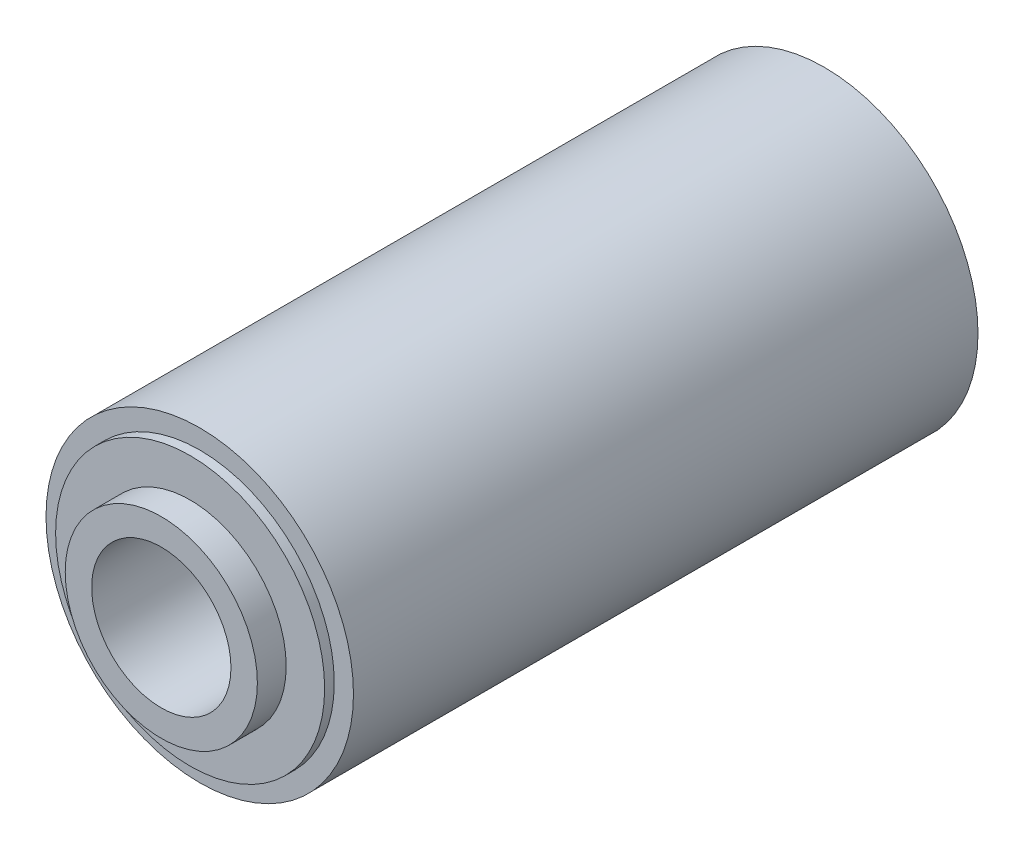
ISO-10303-21;
HEADER;
FILE_DESCRIPTION(('STEP AP214'),'2;1');
FILE_NAME('part.step','',(''),(''),'','','');
FILE_SCHEMA(('AUTOMOTIVE_DESIGN { 1 0 10303 214 1 1 1 1 }'));
ENDSEC;
DATA;
#1=APPLICATION_CONTEXT('core data for automotive mechanical design processes');
#2=APPLICATION_PROTOCOL_DEFINITION('international standard','automotive_design',2000,#1);
#3=PRODUCT_CONTEXT('',#1,'mechanical');
#4=PRODUCT('Part','Part','',(#3));
#5=PRODUCT_RELATED_PRODUCT_CATEGORY('part','',(#4));
#6=PRODUCT_DEFINITION_FORMATION('','',#4);
#7=PRODUCT_DEFINITION_CONTEXT('part definition',#1,'design');
#8=PRODUCT_DEFINITION('design','',#6,#7);
#9=PRODUCT_DEFINITION_SHAPE('','',#8);
#10=(LENGTH_UNIT() NAMED_UNIT(*) SI_UNIT(.MILLI.,.METRE.));
#11=(NAMED_UNIT(*) PLANE_ANGLE_UNIT() SI_UNIT($,.RADIAN.));
#12=(NAMED_UNIT(*) SI_UNIT($,.STERADIAN.) SOLID_ANGLE_UNIT());
#13=UNCERTAINTY_MEASURE_WITH_UNIT(LENGTH_MEASURE(1.E-05),#10,'distance_accuracy_value','');
#14=(GEOMETRIC_REPRESENTATION_CONTEXT(3) GLOBAL_UNCERTAINTY_ASSIGNED_CONTEXT((#13)) GLOBAL_UNIT_ASSIGNED_CONTEXT((#10,
#11,#12)) REPRESENTATION_CONTEXT('',''));
#15=CARTESIAN_POINT('',(0.,0.,0.));
#16=DIRECTION('',(0.,0.,1.));
#17=DIRECTION('',(1.,0.,0.));
#18=AXIS2_PLACEMENT_3D('',#15,#16,#17);
#19=CARTESIAN_POINT('',(0.,0.,3.99999999999999));
#20=DIRECTION('',(0.,0.,1.));
#21=DIRECTION('',(1.,0.,0.));
#22=AXIS2_PLACEMENT_3D('',#19,#20,#21);
#23=CYLINDRICAL_SURFACE('',#22,14.);
#24=CARTESIAN_POINT('',(0.,0.,3.99999999999999));
#25=DIRECTION('',(0.,0.,1.));
#26=DIRECTION('',(1.,0.,0.));
#27=AXIS2_PLACEMENT_3D('',#24,#25,#26);
#28=CIRCLE('',#27,14.);
#29=CARTESIAN_POINT('',(14.,0.,3.99999999999999));
#30=VERTEX_POINT('',#29);
#31=EDGE_CURVE('E59',#30,#30,#28,.T.);
#32=ORIENTED_EDGE('',*,*,#31,.F.);
#33=EDGE_LOOP('',(#32));
#34=FACE_BOUND('',#33,.T.);
#35=CARTESIAN_POINT('',(0.,0.,69.));
#36=DIRECTION('',(0.,0.,1.));
#37=DIRECTION('',(1.,0.,0.));
#38=AXIS2_PLACEMENT_3D('',#35,#36,#37);
#39=CIRCLE('',#38,14.);
#40=CARTESIAN_POINT('',(14.,0.,69.));
#41=VERTEX_POINT('',#40);
#42=EDGE_CURVE('E61',#41,#41,#39,.T.);
#43=ORIENTED_EDGE('',*,*,#42,.T.);
#44=EDGE_LOOP('',(#43));
#45=FACE_BOUND('',#44,.T.);
#46=ADVANCED_FACE('F51',(#34,#45),#23,.F.);
#47=CARTESIAN_POINT('',(0.,0.,3.99999999999999));
#48=DIRECTION('',(0.,0.,1.));
#49=DIRECTION('',(1.,0.,0.));
#50=AXIS2_PLACEMENT_3D('',#47,#48,#49);
#51=CYLINDRICAL_SURFACE('',#50,16.);
#52=CARTESIAN_POINT('',(0.,0.,3.99999999999999));
#53=DIRECTION('',(0.,0.,1.));
#54=DIRECTION('',(1.,0.,0.));
#55=AXIS2_PLACEMENT_3D('',#52,#53,#54);
#56=CIRCLE('',#55,16.);
#57=CARTESIAN_POINT('',(16.,0.,3.99999999999999));
#58=VERTEX_POINT('',#57);
#59=EDGE_CURVE('E11',#58,#58,#56,.T.);
#60=ORIENTED_EDGE('',*,*,#59,.T.);
#61=EDGE_LOOP('',(#60));
#62=FACE_BOUND('',#61,.T.);
#63=CARTESIAN_POINT('',(0.,0.,69.));
#64=DIRECTION('',(0.,0.,1.));
#65=DIRECTION('',(1.,0.,0.));
#66=AXIS2_PLACEMENT_3D('',#63,#64,#65);
#67=CIRCLE('',#66,16.);
#68=CARTESIAN_POINT('',(16.,0.,69.));
#69=VERTEX_POINT('',#68);
#70=EDGE_CURVE('E53',#69,#69,#67,.T.);
#71=ORIENTED_EDGE('',*,*,#70,.F.);
#72=EDGE_LOOP('',(#71));
#73=FACE_BOUND('',#72,.T.);
#74=ADVANCED_FACE('F71',(#62,#73),#51,.T.);
#75=CARTESIAN_POINT('',(0.,0.,3.99999999999999));
#76=DIRECTION('',(0.,0.,1.));
#77=DIRECTION('',(1.,0.,0.));
#78=AXIS2_PLACEMENT_3D('',#75,#76,#77);
#79=PLANE('',#78);
#80=ORIENTED_EDGE('',*,*,#31,.T.);
#81=EDGE_LOOP('',(#80));
#82=FACE_BOUND('',#81,.T.);
#83=ORIENTED_EDGE('',*,*,#59,.F.);
#84=EDGE_LOOP('',(#83));
#85=FACE_BOUND('',#84,.T.);
#86=ADVANCED_FACE('F73',(#82,#85),#79,.F.);
#87=CARTESIAN_POINT('',(0.,0.,69.));
#88=DIRECTION('',(0.,0.,1.));
#89=DIRECTION('',(1.,0.,0.));
#90=AXIS2_PLACEMENT_3D('',#87,#88,#89);
#91=PLANE('',#90);
#92=ORIENTED_EDGE('',*,*,#42,.F.);
#93=EDGE_LOOP('',(#92));
#94=FACE_BOUND('',#93,.T.);
#95=ORIENTED_EDGE('',*,*,#70,.T.);
#96=EDGE_LOOP('',(#95));
#97=FACE_BOUND('',#96,.T.);
#98=ADVANCED_FACE('F72',(#94,#97),#91,.T.);
#99=CLOSED_SHELL('',(#46,#74,#86,#98));
#100=MANIFOLD_SOLID_BREP('B2',#99);
#101=CARTESIAN_POINT('',(0.,0.,2.99999999999999));
#102=DIRECTION('',(0.,0.,1.));
#103=DIRECTION('',(1.,0.,0.));
#104=AXIS2_PLACEMENT_3D('',#101,#102,#103);
#105=CYLINDRICAL_SURFACE('',#104,10.);
#106=CARTESIAN_POINT('',(0.,0.,2.99999999999999));
#107=DIRECTION('',(0.,0.,1.));
#108=DIRECTION('',(1.,0.,0.));
#109=AXIS2_PLACEMENT_3D('',#106,#107,#108);
#110=CIRCLE('',#109,10.);
#111=CARTESIAN_POINT('',(10.,0.,2.99999999999999));
#112=VERTEX_POINT('',#111);
#113=EDGE_CURVE('E127',#112,#112,#110,.T.);
#114=ORIENTED_EDGE('',*,*,#113,.F.);
#115=EDGE_LOOP('',(#114));
#116=FACE_BOUND('',#115,.T.);
#117=CARTESIAN_POINT('',(0.,0.,70.));
#118=DIRECTION('',(0.,0.,1.));
#119=DIRECTION('',(1.,0.,0.));
#120=AXIS2_PLACEMENT_3D('',#117,#118,#119);
#121=CIRCLE('',#120,10.);
#122=CARTESIAN_POINT('',(10.,0.,70.));
#123=VERTEX_POINT('',#122);
#124=EDGE_CURVE('E134',#123,#123,#121,.T.);
#125=ORIENTED_EDGE('',*,*,#124,.T.);
#126=EDGE_LOOP('',(#125));
#127=FACE_BOUND('',#126,.T.);
#128=ADVANCED_FACE('F116',(#116,#127),#105,.F.);
#129=CARTESIAN_POINT('',(0.,0.,2.99999999999999));
#130=DIRECTION('',(0.,0.,1.));
#131=DIRECTION('',(1.,0.,0.));
#132=AXIS2_PLACEMENT_3D('',#129,#130,#131);
#133=CYLINDRICAL_SURFACE('',#132,14.);
#134=CARTESIAN_POINT('',(0.,0.,2.99999999999999));
#135=DIRECTION('',(0.,0.,1.));
#136=DIRECTION('',(1.,0.,0.));
#137=AXIS2_PLACEMENT_3D('',#134,#135,#136);
#138=CIRCLE('',#137,14.);
#139=CARTESIAN_POINT('',(14.,0.,2.99999999999999));
#140=VERTEX_POINT('',#139);
#141=EDGE_CURVE('E49',#140,#140,#138,.T.);
#142=ORIENTED_EDGE('',*,*,#141,.T.);
#143=EDGE_LOOP('',(#142));
#144=FACE_BOUND('',#143,.T.);
#145=CARTESIAN_POINT('',(0.,0.,70.));
#146=DIRECTION('',(0.,0.,1.));
#147=DIRECTION('',(1.,0.,0.));
#148=AXIS2_PLACEMENT_3D('',#145,#146,#147);
#149=CIRCLE('',#148,14.);
#150=CARTESIAN_POINT('',(14.,0.,70.));
#151=VERTEX_POINT('',#150);
#152=EDGE_CURVE('E121',#151,#151,#149,.T.);
#153=ORIENTED_EDGE('',*,*,#152,.F.);
#154=EDGE_LOOP('',(#153));
#155=FACE_BOUND('',#154,.T.);
#156=ADVANCED_FACE('F143',(#144,#155),#133,.T.);
#157=CARTESIAN_POINT('',(0.,0.,2.99999999999999));
#158=DIRECTION('',(0.,0.,1.));
#159=DIRECTION('',(1.,0.,0.));
#160=AXIS2_PLACEMENT_3D('',#157,#158,#159);
#161=PLANE('',#160);
#162=ORIENTED_EDGE('',*,*,#113,.T.);
#163=EDGE_LOOP('',(#162));
#164=FACE_BOUND('',#163,.T.);
#165=ORIENTED_EDGE('',*,*,#141,.F.);
#166=EDGE_LOOP('',(#165));
#167=FACE_BOUND('',#166,.T.);
#168=ADVANCED_FACE('F141',(#164,#167),#161,.F.);
#169=CARTESIAN_POINT('',(0.,0.,70.));
#170=DIRECTION('',(0.,0.,1.));
#171=DIRECTION('',(1.,0.,0.));
#172=AXIS2_PLACEMENT_3D('',#169,#170,#171);
#173=PLANE('',#172);
#174=ORIENTED_EDGE('',*,*,#124,.F.);
#175=EDGE_LOOP('',(#174));
#176=FACE_BOUND('',#175,.T.);
#177=ORIENTED_EDGE('',*,*,#152,.T.);
#178=EDGE_LOOP('',(#177));
#179=FACE_BOUND('',#178,.T.);
#180=ADVANCED_FACE('F136',(#176,#179),#173,.T.);
#181=CLOSED_SHELL('',(#128,#156,#168,#180));
#182=MANIFOLD_SOLID_BREP('B6',#181);
#183=CARTESIAN_POINT('',(0.,0.,73.));
#184=DIRECTION('',(0.,0.,-1.));
#185=DIRECTION('',(-1.,0.,0.));
#186=AXIS2_PLACEMENT_3D('',#183,#184,#185);
#187=CYLINDRICAL_SURFACE('',#186,7.25);
#188=CARTESIAN_POINT('',(0.,0.,73.));
#189=DIRECTION('',(0.,0.,1.));
#190=DIRECTION('',(1.,0.,0.));
#191=AXIS2_PLACEMENT_3D('',#188,#189,#190);
#192=CIRCLE('',#191,7.25);
#193=CARTESIAN_POINT('',(7.25,0.,73.));
#194=VERTEX_POINT('',#193);
#195=EDGE_CURVE('E189',#194,#194,#192,.T.);
#196=ORIENTED_EDGE('',*,*,#195,.T.);
#197=EDGE_LOOP('',(#196));
#198=FACE_BOUND('',#197,.T.);
#199=CARTESIAN_POINT('',(0.,0.,0.));
#200=DIRECTION('',(0.,0.,1.));
#201=DIRECTION('',(1.,0.,0.));
#202=AXIS2_PLACEMENT_3D('',#199,#200,#201);
#203=CIRCLE('',#202,7.25);
#204=CARTESIAN_POINT('',(7.25,0.,0.));
#205=VERTEX_POINT('',#204);
#206=EDGE_CURVE('E194',#205,#205,#203,.T.);
#207=ORIENTED_EDGE('',*,*,#206,.F.);
#208=EDGE_LOOP('',(#207));
#209=FACE_BOUND('',#208,.T.);
#210=ADVANCED_FACE('F177',(#198,#209),#187,.F.);
#211=CARTESIAN_POINT('',(0.,0.,73.));
#212=DIRECTION('',(0.,0.,-1.));
#213=DIRECTION('',(-1.,0.,0.));
#214=AXIS2_PLACEMENT_3D('',#211,#212,#213);
#215=CYLINDRICAL_SURFACE('',#214,10.);
#216=CARTESIAN_POINT('',(0.,0.,73.));
#217=DIRECTION('',(0.,0.,1.));
#218=DIRECTION('',(1.,0.,0.));
#219=AXIS2_PLACEMENT_3D('',#216,#217,#218);
#220=CIRCLE('',#219,10.);
#221=CARTESIAN_POINT('',(10.,0.,73.));
#222=VERTEX_POINT('',#221);
#223=EDGE_CURVE('E120',#222,#222,#220,.T.);
#224=ORIENTED_EDGE('',*,*,#223,.F.);
#225=EDGE_LOOP('',(#224));
#226=FACE_BOUND('',#225,.T.);
#227=CARTESIAN_POINT('',(0.,0.,0.));
#228=DIRECTION('',(0.,0.,1.));
#229=DIRECTION('',(1.,0.,0.));
#230=AXIS2_PLACEMENT_3D('',#227,#228,#229);
#231=CIRCLE('',#230,10.);
#232=CARTESIAN_POINT('',(10.,0.,0.));
#233=VERTEX_POINT('',#232);
#234=EDGE_CURVE('E181',#233,#233,#231,.T.);
#235=ORIENTED_EDGE('',*,*,#234,.T.);
#236=EDGE_LOOP('',(#235));
#237=FACE_BOUND('',#236,.T.);
#238=ADVANCED_FACE('F199',(#226,#237),#215,.T.);
#239=CARTESIAN_POINT('',(0.,0.,73.));
#240=DIRECTION('',(0.,0.,1.));
#241=DIRECTION('',(1.,0.,0.));
#242=AXIS2_PLACEMENT_3D('',#239,#240,#241);
#243=PLANE('',#242);
#244=ORIENTED_EDGE('',*,*,#195,.F.);
#245=EDGE_LOOP('',(#244));
#246=FACE_BOUND('',#245,.T.);
#247=ORIENTED_EDGE('',*,*,#223,.T.);
#248=EDGE_LOOP('',(#247));
#249=FACE_BOUND('',#248,.T.);
#250=ADVANCED_FACE('F204',(#246,#249),#243,.T.);
#251=CARTESIAN_POINT('',(0.,0.,0.));
#252=DIRECTION('',(0.,0.,1.));
#253=DIRECTION('',(1.,0.,0.));
#254=AXIS2_PLACEMENT_3D('',#251,#252,#253);
#255=PLANE('',#254);
#256=ORIENTED_EDGE('',*,*,#206,.T.);
#257=EDGE_LOOP('',(#256));
#258=FACE_BOUND('',#257,.T.);
#259=ORIENTED_EDGE('',*,*,#234,.F.);
#260=EDGE_LOOP('',(#259));
#261=FACE_BOUND('',#260,.T.);
#262=ADVANCED_FACE('F205',(#258,#261),#255,.F.);
#263=CLOSED_SHELL('',(#210,#238,#250,#262));
#264=MANIFOLD_SOLID_BREP('B44',#263);
#265=ADVANCED_BREP_SHAPE_REPRESENTATION('',(#18,#100,#182,#264),#14);
#266=SHAPE_DEFINITION_REPRESENTATION(#9,#265);
ENDSEC;
END-ISO-10303-21;
